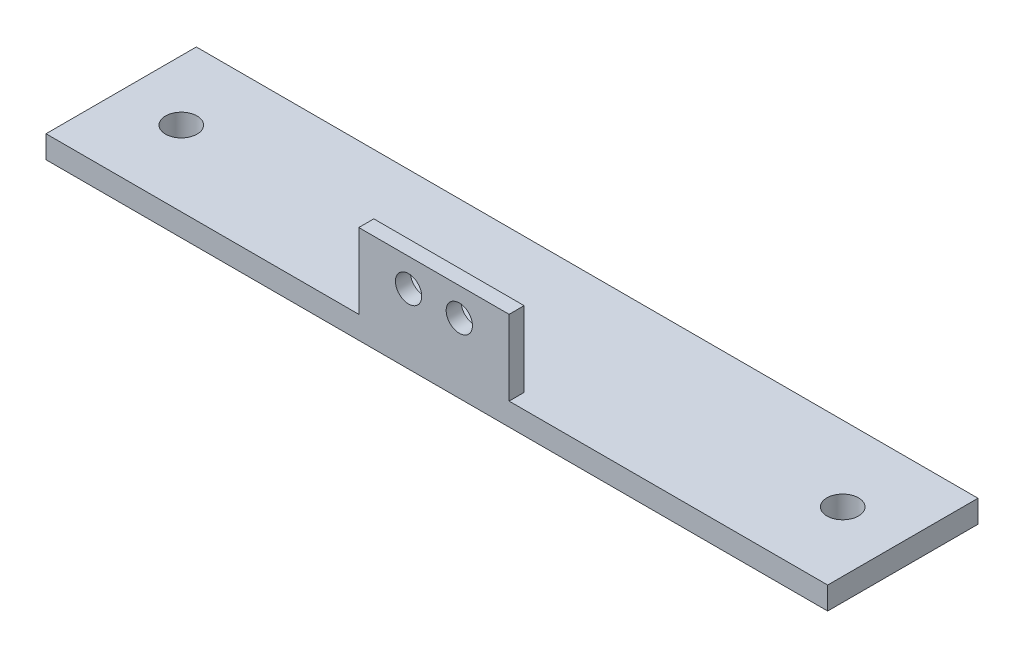
ISO-10303-21;
HEADER;
FILE_DESCRIPTION(('STEP AP214'),'2;1');
FILE_NAME('part.step','',(''),(''),'','','');
FILE_SCHEMA(('AUTOMOTIVE_DESIGN { 1 0 10303 214 1 1 1 1 }'));
ENDSEC;
DATA;
#1=APPLICATION_CONTEXT('core data for automotive mechanical design processes');
#2=APPLICATION_PROTOCOL_DEFINITION('international standard','automotive_design',2000,#1);
#3=PRODUCT_CONTEXT('',#1,'mechanical');
#4=PRODUCT('Part','Part','',(#3));
#5=PRODUCT_RELATED_PRODUCT_CATEGORY('part','',(#4));
#6=PRODUCT_DEFINITION_FORMATION('','',#4);
#7=PRODUCT_DEFINITION_CONTEXT('part definition',#1,'design');
#8=PRODUCT_DEFINITION('design','',#6,#7);
#9=PRODUCT_DEFINITION_SHAPE('','',#8);
#10=(LENGTH_UNIT() NAMED_UNIT(*) SI_UNIT(.MILLI.,.METRE.));
#11=(NAMED_UNIT(*) PLANE_ANGLE_UNIT() SI_UNIT($,.RADIAN.));
#12=(NAMED_UNIT(*) SI_UNIT($,.STERADIAN.) SOLID_ANGLE_UNIT());
#13=UNCERTAINTY_MEASURE_WITH_UNIT(LENGTH_MEASURE(1.E-05),#10,'distance_accuracy_value','');
#14=(GEOMETRIC_REPRESENTATION_CONTEXT(3) GLOBAL_UNCERTAINTY_ASSIGNED_CONTEXT((#13)) GLOBAL_UNIT_ASSIGNED_CONTEXT((#10,
#11,#12)) REPRESENTATION_CONTEXT('',''));
#15=CARTESIAN_POINT('',(0.,0.,0.));
#16=DIRECTION('',(0.,0.,1.));
#17=DIRECTION('',(1.,0.,0.));
#18=AXIS2_PLACEMENT_3D('',#15,#16,#17);
#19=CARTESIAN_POINT('',(0.,3.,-0.165016501650159));
#20=DIRECTION('',(0.,0.,-1.));
#21=DIRECTION('',(-1.,0.,0.));
#22=AXIS2_PLACEMENT_3D('',#19,#20,#21);
#23=PLANE('',#22);
#24=CARTESIAN_POINT('',(-3.55294393808826,9.25,-0.165016501650159));
#25=DIRECTION('',(0.,0.,1.));
#26=DIRECTION('',(1.,0.,0.));
#27=AXIS2_PLACEMENT_3D('',#24,#25,#26);
#28=CIRCLE('',#27,1.75);
#29=CARTESIAN_POINT('',(-1.80294393808826,9.25,-0.165016501650159));
#30=VERTEX_POINT('',#29);
#31=EDGE_CURVE('E168',#30,#30,#28,.T.);
#32=ORIENTED_EDGE('',*,*,#31,.F.);
#33=EDGE_LOOP('',(#32));
#34=FACE_BOUND('',#33,.T.);
#35=CARTESIAN_POINT('',(3.19705606191174,9.25,-0.165016501650159));
#36=DIRECTION('',(0.,0.,1.));
#37=DIRECTION('',(1.,0.,0.));
#38=AXIS2_PLACEMENT_3D('',#35,#36,#37);
#39=CIRCLE('',#38,1.75);
#40=CARTESIAN_POINT('',(4.94705606191174,9.25,-0.165016501650159));
#41=VERTEX_POINT('',#40);
#42=EDGE_CURVE('E173',#41,#41,#39,.T.);
#43=ORIENTED_EDGE('',*,*,#42,.F.);
#44=EDGE_LOOP('',(#43));
#45=FACE_BOUND('',#44,.T.);
#46=DIRECTION('',(1.,0.,0.));
#47=VECTOR('',#46,1.);
#48=CARTESIAN_POINT('',(0.,0.,-0.165016501650159));
#49=LINE('',#48,#47);
#50=CARTESIAN_POINT('',(-51.7913418239872,0.,-0.165016501650159));
#51=VERTEX_POINT('',#50);
#52=CARTESIAN_POINT('',(52.2086581760128,0.,-0.165016501650159));
#53=VERTEX_POINT('',#52);
#54=EDGE_CURVE('E153',#51,#53,#49,.T.);
#55=ORIENTED_EDGE('',*,*,#54,.T.);
#56=DIRECTION('',(0.,-1.,0.));
#57=VECTOR('',#56,1.);
#58=CARTESIAN_POINT('',(52.2086581760128,3.,-0.165016501650159));
#59=LINE('',#58,#57);
#60=CARTESIAN_POINT('',(52.2086581760128,3.,-0.165016501650159));
#61=VERTEX_POINT('',#60);
#62=EDGE_CURVE('E11',#61,#53,#59,.T.);
#63=ORIENTED_EDGE('',*,*,#62,.F.);
#64=DIRECTION('',(1.,0.,0.));
#65=VECTOR('',#64,1.);
#66=CARTESIAN_POINT('',(0.,3.,-0.165016501650159));
#67=LINE('',#66,#65);
#68=CARTESIAN_POINT('',(9.82205606191173,3.,-0.165016501650159));
#69=VERTEX_POINT('',#68);
#70=EDGE_CURVE('E139',#69,#61,#67,.T.);
#71=ORIENTED_EDGE('',*,*,#70,.F.);
#72=DIRECTION('',(0.,-1.,0.));
#73=VECTOR('',#72,1.);
#74=CARTESIAN_POINT('',(9.82205606191173,13.,-0.165016501650159));
#75=LINE('',#74,#73);
#76=CARTESIAN_POINT('',(9.82205606191173,13.,-0.165016501650159));
#77=VERTEX_POINT('',#76);
#78=EDGE_CURVE('E107',#77,#69,#75,.T.);
#79=ORIENTED_EDGE('',*,*,#78,.F.);
#80=DIRECTION('',(1.,0.,0.));
#81=VECTOR('',#80,1.);
#82=CARTESIAN_POINT('',(-0.177943938088254,13.,-0.165016501650159));
#83=LINE('',#82,#81);
#84=CARTESIAN_POINT('',(-10.1779439380883,13.,-0.165016501650159));
#85=VERTEX_POINT('',#84);
#86=EDGE_CURVE('E100',#85,#77,#83,.T.);
#87=ORIENTED_EDGE('',*,*,#86,.F.);
#88=DIRECTION('',(0.,-1.,0.));
#89=VECTOR('',#88,1.);
#90=CARTESIAN_POINT('',(-10.1779439380883,13.,-0.165016501650159));
#91=LINE('',#90,#89);
#92=CARTESIAN_POINT('',(-10.1779439380883,3.,-0.165016501650159));
#93=VERTEX_POINT('',#92);
#94=EDGE_CURVE('E105',#85,#93,#91,.T.);
#95=ORIENTED_EDGE('',*,*,#94,.T.);
#96=CARTESIAN_POINT('',(-51.7913418239872,3.,-0.165016501650159));
#97=VERTEX_POINT('',#96);
#98=EDGE_CURVE('E140',#97,#93,#67,.T.);
#99=ORIENTED_EDGE('',*,*,#98,.F.);
#100=DIRECTION('',(0.,-1.,0.));
#101=VECTOR('',#100,1.);
#102=CARTESIAN_POINT('',(-51.7913418239872,3.,-0.165016501650159));
#103=LINE('',#102,#101);
#104=EDGE_CURVE('E149',#97,#51,#103,.T.);
#105=ORIENTED_EDGE('',*,*,#104,.T.);
#106=EDGE_LOOP('',(#55,#63,#71,#79,#87,#95,#99,#105));
#107=FACE_BOUND('',#106,.T.);
#108=ADVANCED_FACE('F35',(#34,#45,#107),#23,.F.);
#109=CARTESIAN_POINT('',(52.2086581760128,3.,0.));
#110=DIRECTION('',(1.,0.,0.));
#111=DIRECTION('',(0.,0.,-1.));
#112=AXIS2_PLACEMENT_3D('',#109,#110,#111);
#113=PLANE('',#112);
#114=DIRECTION('',(0.,0.,1.));
#115=VECTOR('',#114,1.);
#116=CARTESIAN_POINT('',(52.2086581760128,0.,0.));
#117=LINE('',#116,#115);
#118=CARTESIAN_POINT('',(52.2086581760128,0.,-20.1650165016502));
#119=VERTEX_POINT('',#118);
#120=EDGE_CURVE('E155',#119,#53,#117,.T.);
#121=ORIENTED_EDGE('',*,*,#120,.F.);
#122=DIRECTION('',(0.,-1.,0.));
#123=VECTOR('',#122,1.);
#124=CARTESIAN_POINT('',(52.2086581760128,3.,-20.1650165016502));
#125=LINE('',#124,#123);
#126=CARTESIAN_POINT('',(52.2086581760128,3.,-20.1650165016502));
#127=VERTEX_POINT('',#126);
#128=EDGE_CURVE('E44',#127,#119,#125,.T.);
#129=ORIENTED_EDGE('',*,*,#128,.F.);
#130=DIRECTION('',(0.,0.,1.));
#131=VECTOR('',#130,1.);
#132=CARTESIAN_POINT('',(52.2086581760128,3.,0.));
#133=LINE('',#132,#131);
#134=EDGE_CURVE('E142',#127,#61,#133,.T.);
#135=ORIENTED_EDGE('',*,*,#134,.T.);
#136=ORIENTED_EDGE('',*,*,#62,.T.);
#137=EDGE_LOOP('',(#121,#129,#135,#136));
#138=FACE_BOUND('',#137,.T.);
#139=ADVANCED_FACE('F203',(#138),#113,.T.);
#140=CARTESIAN_POINT('',(0.,3.,-20.1650165016502));
#141=DIRECTION('',(0.,0.,-1.));
#142=DIRECTION('',(-1.,0.,0.));
#143=AXIS2_PLACEMENT_3D('',#140,#141,#142);
#144=PLANE('',#143);
#145=DIRECTION('',(1.,0.,0.));
#146=VECTOR('',#145,1.);
#147=CARTESIAN_POINT('',(0.,0.,-20.1650165016502));
#148=LINE('',#147,#146);
#149=CARTESIAN_POINT('',(-51.7913418239872,0.,-20.1650165016502));
#150=VERTEX_POINT('',#149);
#151=EDGE_CURVE('E158',#150,#119,#148,.T.);
#152=ORIENTED_EDGE('',*,*,#151,.F.);
#153=DIRECTION('',(0.,-1.,0.));
#154=VECTOR('',#153,1.);
#155=CARTESIAN_POINT('',(-51.7913418239872,3.,-20.1650165016502));
#156=LINE('',#155,#154);
#157=CARTESIAN_POINT('',(-51.7913418239872,3.,-20.1650165016502));
#158=VERTEX_POINT('',#157);
#159=EDGE_CURVE('E164',#158,#150,#156,.T.);
#160=ORIENTED_EDGE('',*,*,#159,.F.);
#161=DIRECTION('',(1.,0.,0.));
#162=VECTOR('',#161,1.);
#163=CARTESIAN_POINT('',(0.,3.,-20.1650165016502));
#164=LINE('',#163,#162);
#165=EDGE_CURVE('E145',#158,#127,#164,.T.);
#166=ORIENTED_EDGE('',*,*,#165,.T.);
#167=ORIENTED_EDGE('',*,*,#128,.T.);
#168=EDGE_LOOP('',(#152,#160,#166,#167));
#169=FACE_BOUND('',#168,.T.);
#170=ADVANCED_FACE('F209',(#169),#144,.T.);
#171=CARTESIAN_POINT('',(-43.7913418239872,3.,-10.1650165016502));
#172=DIRECTION('',(0.,-1.,0.));
#173=DIRECTION('',(0.,0.,-1.));
#174=AXIS2_PLACEMENT_3D('',#171,#172,#173);
#175=CYLINDRICAL_SURFACE('',#174,2.1);
#176=CARTESIAN_POINT('',(-43.7913418239872,3.,-10.1650165016502));
#177=DIRECTION('',(0.,1.,0.));
#178=DIRECTION('',(0.,0.,1.));
#179=AXIS2_PLACEMENT_3D('',#176,#177,#178);
#180=CIRCLE('',#179,2.1);
#181=CARTESIAN_POINT('',(-43.7913418239872,3.,-8.06501650165016));
#182=VERTEX_POINT('',#181);
#183=EDGE_CURVE('E135',#182,#182,#180,.T.);
#184=ORIENTED_EDGE('',*,*,#183,.T.);
#185=EDGE_LOOP('',(#184));
#186=FACE_BOUND('',#185,.T.);
#187=CARTESIAN_POINT('',(-43.7913418239872,0.,-10.1650165016502));
#188=DIRECTION('',(0.,1.,0.));
#189=DIRECTION('',(0.,0.,1.));
#190=AXIS2_PLACEMENT_3D('',#187,#188,#189);
#191=CIRCLE('',#190,2.1);
#192=CARTESIAN_POINT('',(-43.7913418239872,0.,-8.06501650165016));
#193=VERTEX_POINT('',#192);
#194=EDGE_CURVE('E126',#193,#193,#191,.T.);
#195=ORIENTED_EDGE('',*,*,#194,.F.);
#196=EDGE_LOOP('',(#195));
#197=FACE_BOUND('',#196,.T.);
#198=ADVANCED_FACE('F214',(#186,#197),#175,.F.);
#199=CARTESIAN_POINT('',(44.2086581760128,3.,-10.1650165016502));
#200=DIRECTION('',(0.,-1.,0.));
#201=DIRECTION('',(0.,0.,-1.));
#202=AXIS2_PLACEMENT_3D('',#199,#200,#201);
#203=CYLINDRICAL_SURFACE('',#202,2.1);
#204=CARTESIAN_POINT('',(44.2086581760128,3.,-10.1650165016502));
#205=DIRECTION('',(0.,1.,0.));
#206=DIRECTION('',(0.,0.,1.));
#207=AXIS2_PLACEMENT_3D('',#204,#205,#206);
#208=CIRCLE('',#207,2.1);
#209=CARTESIAN_POINT('',(44.2086581760128,3.,-8.06501650165016));
#210=VERTEX_POINT('',#209);
#211=EDGE_CURVE('E132',#210,#210,#208,.T.);
#212=ORIENTED_EDGE('',*,*,#211,.T.);
#213=EDGE_LOOP('',(#212));
#214=FACE_BOUND('',#213,.T.);
#215=CARTESIAN_POINT('',(44.2086581760128,0.,-10.1650165016502));
#216=DIRECTION('',(0.,1.,0.));
#217=DIRECTION('',(0.,0.,1.));
#218=AXIS2_PLACEMENT_3D('',#215,#216,#217);
#219=CIRCLE('',#218,2.1);
#220=CARTESIAN_POINT('',(44.2086581760128,0.,-8.06501650165016));
#221=VERTEX_POINT('',#220);
#222=EDGE_CURVE('E123',#221,#221,#219,.T.);
#223=ORIENTED_EDGE('',*,*,#222,.F.);
#224=EDGE_LOOP('',(#223));
#225=FACE_BOUND('',#224,.T.);
#226=ADVANCED_FACE('F37',(#214,#225),#203,.F.);
#227=CARTESIAN_POINT('',(-51.7913418239872,3.,0.));
#228=DIRECTION('',(1.,0.,0.));
#229=DIRECTION('',(0.,0.,-1.));
#230=AXIS2_PLACEMENT_3D('',#227,#228,#229);
#231=PLANE('',#230);
#232=DIRECTION('',(0.,0.,1.));
#233=VECTOR('',#232,1.);
#234=CARTESIAN_POINT('',(-51.7913418239872,0.,0.));
#235=LINE('',#234,#233);
#236=EDGE_CURVE('E136',#150,#51,#235,.T.);
#237=ORIENTED_EDGE('',*,*,#236,.T.);
#238=ORIENTED_EDGE('',*,*,#104,.F.);
#239=DIRECTION('',(0.,0.,1.));
#240=VECTOR('',#239,1.);
#241=CARTESIAN_POINT('',(-51.7913418239872,3.,0.));
#242=LINE('',#241,#240);
#243=EDGE_CURVE('E148',#158,#97,#242,.T.);
#244=ORIENTED_EDGE('',*,*,#243,.F.);
#245=ORIENTED_EDGE('',*,*,#159,.T.);
#246=EDGE_LOOP('',(#237,#238,#244,#245));
#247=FACE_BOUND('',#246,.T.);
#248=ADVANCED_FACE('F221',(#247),#231,.F.);
#249=CARTESIAN_POINT('',(0.,3.,0.));
#250=DIRECTION('',(0.,1.,0.));
#251=DIRECTION('',(0.,0.,1.));
#252=AXIS2_PLACEMENT_3D('',#249,#250,#251);
#253=PLANE('',#252);
#254=DIRECTION('',(0.,0.,1.));
#255=VECTOR('',#254,1.);
#256=CARTESIAN_POINT('',(-10.1779439380883,3.,-0.165016501650159));
#257=LINE('',#256,#255);
#258=CARTESIAN_POINT('',(-10.1779439380883,3.,-2.16501650165016));
#259=VERTEX_POINT('',#258);
#260=EDGE_CURVE('E52',#259,#93,#257,.T.);
#261=ORIENTED_EDGE('',*,*,#260,.F.);
#262=DIRECTION('',(-1.,0.,0.));
#263=VECTOR('',#262,1.);
#264=CARTESIAN_POINT('',(-10.1779439380883,3.,-2.16501650165016));
#265=LINE('',#264,#263);
#266=CARTESIAN_POINT('',(9.82205606191173,3.,-2.16501650165016));
#267=VERTEX_POINT('',#266);
#268=EDGE_CURVE('E120',#267,#259,#265,.T.);
#269=ORIENTED_EDGE('',*,*,#268,.F.);
#270=DIRECTION('',(0.,0.,-1.));
#271=VECTOR('',#270,1.);
#272=CARTESIAN_POINT('',(9.82205606191173,3.,-2.16501650165016));
#273=LINE('',#272,#271);
#274=EDGE_CURVE('E58',#69,#267,#273,.T.);
#275=ORIENTED_EDGE('',*,*,#274,.F.);
#276=ORIENTED_EDGE('',*,*,#70,.T.);
#277=ORIENTED_EDGE('',*,*,#134,.F.);
#278=ORIENTED_EDGE('',*,*,#165,.F.);
#279=ORIENTED_EDGE('',*,*,#243,.T.);
#280=ORIENTED_EDGE('',*,*,#98,.T.);
#281=EDGE_LOOP('',(#261,#269,#275,#276,#277,#278,#279,#280));
#282=FACE_BOUND('',#281,.T.);
#283=ORIENTED_EDGE('',*,*,#211,.F.);
#284=EDGE_LOOP('',(#283));
#285=FACE_BOUND('',#284,.T.);
#286=ORIENTED_EDGE('',*,*,#183,.F.);
#287=EDGE_LOOP('',(#286));
#288=FACE_BOUND('',#287,.T.);
#289=ADVANCED_FACE('F230',(#282,#285,#288),#253,.T.);
#290=CARTESIAN_POINT('',(0.,0.,0.));
#291=DIRECTION('',(0.,1.,0.));
#292=DIRECTION('',(0.,0.,1.));
#293=AXIS2_PLACEMENT_3D('',#290,#291,#292);
#294=PLANE('',#293);
#295=ORIENTED_EDGE('',*,*,#222,.T.);
#296=EDGE_LOOP('',(#295));
#297=FACE_BOUND('',#296,.T.);
#298=ORIENTED_EDGE('',*,*,#194,.T.);
#299=EDGE_LOOP('',(#298));
#300=FACE_BOUND('',#299,.T.);
#301=ORIENTED_EDGE('',*,*,#54,.F.);
#302=ORIENTED_EDGE('',*,*,#236,.F.);
#303=ORIENTED_EDGE('',*,*,#151,.T.);
#304=ORIENTED_EDGE('',*,*,#120,.T.);
#305=EDGE_LOOP('',(#301,#302,#303,#304));
#306=FACE_BOUND('',#305,.T.);
#307=ADVANCED_FACE('F200',(#297,#300,#306),#294,.F.);
#308=CARTESIAN_POINT('',(-10.1779439380883,13.,-0.165016501650159));
#309=DIRECTION('',(1.,0.,0.));
#310=DIRECTION('',(0.,0.,-1.));
#311=AXIS2_PLACEMENT_3D('',#308,#309,#310);
#312=PLANE('',#311);
#313=ORIENTED_EDGE('',*,*,#260,.T.);
#314=ORIENTED_EDGE('',*,*,#94,.F.);
#315=DIRECTION('',(0.,0.,1.));
#316=VECTOR('',#315,1.);
#317=CARTESIAN_POINT('',(-10.1779439380883,13.,-0.165016501650159));
#318=LINE('',#317,#316);
#319=CARTESIAN_POINT('',(-10.1779439380883,13.,-2.16501650165016));
#320=VERTEX_POINT('',#319);
#321=EDGE_CURVE('E111',#320,#85,#318,.T.);
#322=ORIENTED_EDGE('',*,*,#321,.F.);
#323=DIRECTION('',(0.,-1.,0.));
#324=VECTOR('',#323,1.);
#325=CARTESIAN_POINT('',(-10.1779439380883,13.,-2.16501650165016));
#326=LINE('',#325,#324);
#327=EDGE_CURVE('E182',#320,#259,#326,.T.);
#328=ORIENTED_EDGE('',*,*,#327,.T.);
#329=EDGE_LOOP('',(#313,#314,#322,#328));
#330=FACE_BOUND('',#329,.T.);
#331=ADVANCED_FACE('F122',(#330),#312,.F.);
#332=CARTESIAN_POINT('',(9.82205606191173,13.,-2.16501650165016));
#333=DIRECTION('',(-1.,0.,0.));
#334=DIRECTION('',(0.,0.,1.));
#335=AXIS2_PLACEMENT_3D('',#332,#333,#334);
#336=PLANE('',#335);
#337=ORIENTED_EDGE('',*,*,#274,.T.);
#338=DIRECTION('',(0.,-1.,0.));
#339=VECTOR('',#338,1.);
#340=CARTESIAN_POINT('',(9.82205606191173,13.,-2.16501650165016));
#341=LINE('',#340,#339);
#342=CARTESIAN_POINT('',(9.82205606191173,13.,-2.16501650165016));
#343=VERTEX_POINT('',#342);
#344=EDGE_CURVE('E128',#343,#267,#341,.T.);
#345=ORIENTED_EDGE('',*,*,#344,.F.);
#346=DIRECTION('',(0.,0.,-1.));
#347=VECTOR('',#346,1.);
#348=CARTESIAN_POINT('',(9.82205606191173,13.,-2.16501650165016));
#349=LINE('',#348,#347);
#350=EDGE_CURVE('E110',#77,#343,#349,.T.);
#351=ORIENTED_EDGE('',*,*,#350,.F.);
#352=ORIENTED_EDGE('',*,*,#78,.T.);
#353=EDGE_LOOP('',(#337,#345,#351,#352));
#354=FACE_BOUND('',#353,.T.);
#355=ADVANCED_FACE('F191',(#354),#336,.F.);
#356=CARTESIAN_POINT('',(-10.1779439380883,13.,-2.16501650165016));
#357=DIRECTION('',(0.,0.,1.));
#358=DIRECTION('',(1.,0.,0.));
#359=AXIS2_PLACEMENT_3D('',#356,#357,#358);
#360=PLANE('',#359);
#361=CARTESIAN_POINT('',(-3.55294393808826,9.25,-2.16501650165016));
#362=DIRECTION('',(0.,0.,1.));
#363=DIRECTION('',(1.,0.,0.));
#364=AXIS2_PLACEMENT_3D('',#361,#362,#363);
#365=CIRCLE('',#364,1.75);
#366=CARTESIAN_POINT('',(-1.80294393808826,9.25,-2.16501650165016));
#367=VERTEX_POINT('',#366);
#368=EDGE_CURVE('E39',#367,#367,#365,.T.);
#369=ORIENTED_EDGE('',*,*,#368,.T.);
#370=EDGE_LOOP('',(#369));
#371=FACE_BOUND('',#370,.T.);
#372=CARTESIAN_POINT('',(3.19705606191174,9.25,-2.16501650165016));
#373=DIRECTION('',(0.,0.,1.));
#374=DIRECTION('',(1.,0.,0.));
#375=AXIS2_PLACEMENT_3D('',#372,#373,#374);
#376=CIRCLE('',#375,1.75);
#377=CARTESIAN_POINT('',(4.94705606191174,9.25,-2.16501650165016));
#378=VERTEX_POINT('',#377);
#379=EDGE_CURVE('E166',#378,#378,#376,.T.);
#380=ORIENTED_EDGE('',*,*,#379,.T.);
#381=EDGE_LOOP('',(#380));
#382=FACE_BOUND('',#381,.T.);
#383=ORIENTED_EDGE('',*,*,#268,.T.);
#384=ORIENTED_EDGE('',*,*,#327,.F.);
#385=DIRECTION('',(-1.,0.,0.));
#386=VECTOR('',#385,1.);
#387=CARTESIAN_POINT('',(-10.1779439380883,13.,-2.16501650165016));
#388=LINE('',#387,#386);
#389=EDGE_CURVE('E116',#343,#320,#388,.T.);
#390=ORIENTED_EDGE('',*,*,#389,.F.);
#391=ORIENTED_EDGE('',*,*,#344,.T.);
#392=EDGE_LOOP('',(#383,#384,#390,#391));
#393=FACE_BOUND('',#392,.T.);
#394=ADVANCED_FACE('F189',(#371,#382,#393),#360,.F.);
#395=CARTESIAN_POINT('',(0.,13.,0.));
#396=DIRECTION('',(0.,-1.,0.));
#397=DIRECTION('',(0.,0.,-1.));
#398=AXIS2_PLACEMENT_3D('',#395,#396,#397);
#399=PLANE('',#398);
#400=ORIENTED_EDGE('',*,*,#321,.T.);
#401=ORIENTED_EDGE('',*,*,#86,.T.);
#402=ORIENTED_EDGE('',*,*,#350,.T.);
#403=ORIENTED_EDGE('',*,*,#389,.T.);
#404=EDGE_LOOP('',(#400,#401,#402,#403));
#405=FACE_BOUND('',#404,.T.);
#406=ADVANCED_FACE('F114',(#405),#399,.F.);
#407=CARTESIAN_POINT('',(3.19705606191174,9.25,-10.1650165016502));
#408=DIRECTION('',(0.,0.,1.));
#409=DIRECTION('',(1.,0.,0.));
#410=AXIS2_PLACEMENT_3D('',#407,#408,#409);
#411=CYLINDRICAL_SURFACE('',#410,1.75);
#412=ORIENTED_EDGE('',*,*,#42,.T.);
#413=EDGE_LOOP('',(#412));
#414=FACE_BOUND('',#413,.T.);
#415=ORIENTED_EDGE('',*,*,#379,.F.);
#416=EDGE_LOOP('',(#415));
#417=FACE_BOUND('',#416,.T.);
#418=ADVANCED_FACE('F315',(#414,#417),#411,.F.);
#419=CARTESIAN_POINT('',(-3.55294393808826,9.25,-10.1650165016502));
#420=DIRECTION('',(0.,0.,1.));
#421=DIRECTION('',(1.,0.,0.));
#422=AXIS2_PLACEMENT_3D('',#419,#420,#421);
#423=CYLINDRICAL_SURFACE('',#422,1.75);
#424=ORIENTED_EDGE('',*,*,#31,.T.);
#425=EDGE_LOOP('',(#424));
#426=FACE_BOUND('',#425,.T.);
#427=ORIENTED_EDGE('',*,*,#368,.F.);
#428=EDGE_LOOP('',(#427));
#429=FACE_BOUND('',#428,.T.);
#430=ADVANCED_FACE('F331',(#426,#429),#423,.F.);
#431=CLOSED_SHELL('',(#108,#139,#170,#198,#226,#248,#289,#307,#331,#355,#394,#406,#418,#430));
#432=MANIFOLD_SOLID_BREP('B2',#431);
#433=ADVANCED_BREP_SHAPE_REPRESENTATION('',(#18,#432),#14);
#434=SHAPE_DEFINITION_REPRESENTATION(#9,#433);
ENDSEC;
END-ISO-10303-21;
